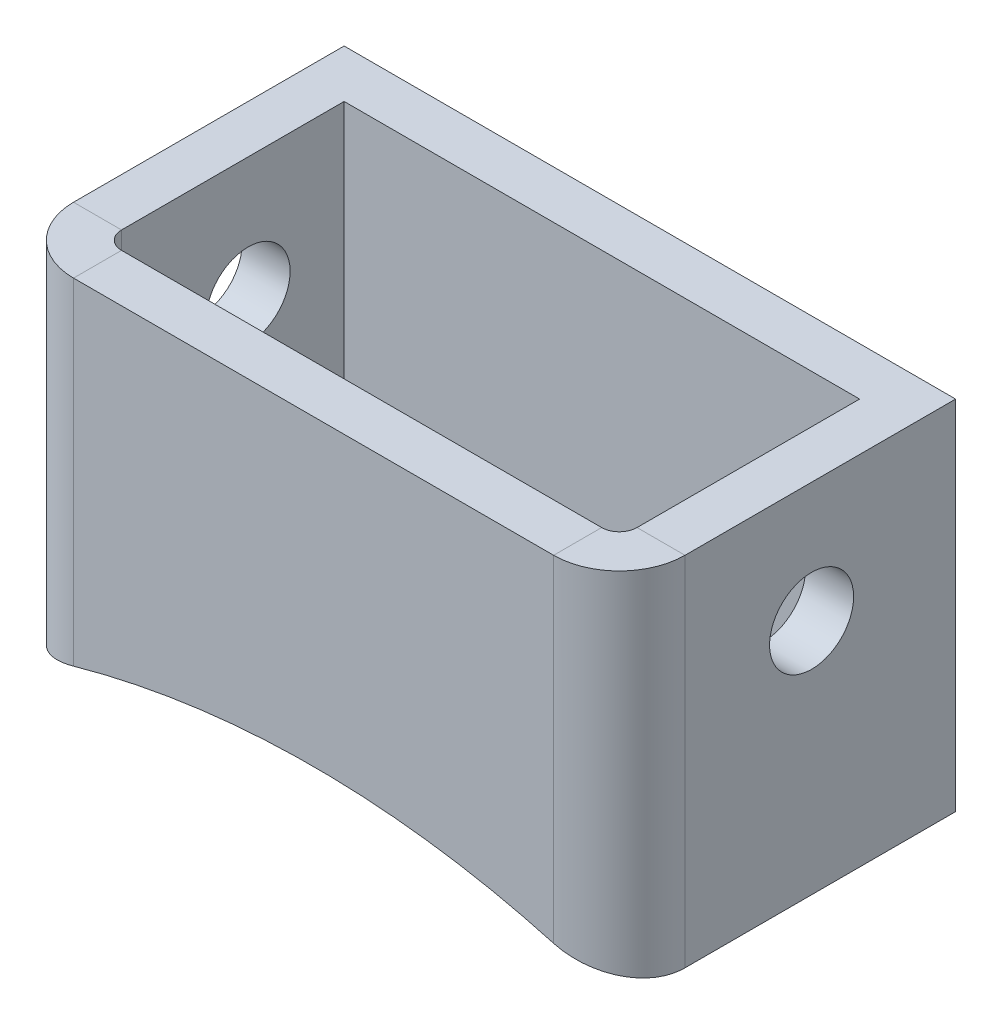
ISO-10303-21;
HEADER;
FILE_DESCRIPTION(('STEP AP214'),'2;1');
FILE_NAME('part.step','',(''),(''),'','','');
FILE_SCHEMA(('AUTOMOTIVE_DESIGN { 1 0 10303 214 1 1 1 1 }'));
ENDSEC;
DATA;
#1=APPLICATION_CONTEXT('core data for automotive mechanical design processes');
#2=APPLICATION_PROTOCOL_DEFINITION('international standard','automotive_design',2000,#1);
#3=PRODUCT_CONTEXT('',#1,'mechanical');
#4=PRODUCT('Part','Part','',(#3));
#5=PRODUCT_RELATED_PRODUCT_CATEGORY('part','',(#4));
#6=PRODUCT_DEFINITION_FORMATION('','',#4);
#7=PRODUCT_DEFINITION_CONTEXT('part definition',#1,'design');
#8=PRODUCT_DEFINITION('design','',#6,#7);
#9=PRODUCT_DEFINITION_SHAPE('','',#8);
#10=(LENGTH_UNIT() NAMED_UNIT(*) SI_UNIT(.MILLI.,.METRE.));
#11=(NAMED_UNIT(*) PLANE_ANGLE_UNIT() SI_UNIT($,.RADIAN.));
#12=(NAMED_UNIT(*) SI_UNIT($,.STERADIAN.) SOLID_ANGLE_UNIT());
#13=UNCERTAINTY_MEASURE_WITH_UNIT(LENGTH_MEASURE(1.E-05),#10,'distance_accuracy_value','');
#14=(GEOMETRIC_REPRESENTATION_CONTEXT(3) GLOBAL_UNCERTAINTY_ASSIGNED_CONTEXT((#13)) GLOBAL_UNIT_ASSIGNED_CONTEXT((#10,
#11,#12)) REPRESENTATION_CONTEXT('',''));
#15=CARTESIAN_POINT('',(0.,0.,0.));
#16=DIRECTION('',(0.,0.,1.));
#17=DIRECTION('',(1.,0.,0.));
#18=AXIS2_PLACEMENT_3D('',#15,#16,#17);
#19=CARTESIAN_POINT('',(0.,-42.6230262611138,0.));
#20=DIRECTION('',(0.,0.,1.));
#21=DIRECTION('',(1.,0.,0.));
#22=AXIS2_PLACEMENT_3D('',#19,#20,#21);
#23=PLANE('',#22);
#24=CARTESIAN_POINT('',(0.,-42.6230262611138,0.));
#25=DIRECTION('',(0.,0.,-1.));
#26=DIRECTION('',(1.,0.,0.));
#27=AXIS2_PLACEMENT_3D('',#24,#25,#26);
#28=CIRCLE('',#27,37.);
#29=CARTESIAN_POINT('',(-9.99999999999999,-7.,0.));
#30=VERTEX_POINT('',#29);
#31=CARTESIAN_POINT('',(10.,-7.,0.));
#32=VERTEX_POINT('',#31);
#33=EDGE_CURVE('E235',#30,#32,#28,.T.);
#34=ORIENTED_EDGE('',*,*,#33,.T.);
#35=DIRECTION('',(0.,1.,0.));
#36=VECTOR('',#35,1.);
#37=CARTESIAN_POINT('',(9.99999999999999,-42.6230262611138,0.));
#38=LINE('',#37,#36);
#39=CARTESIAN_POINT('',(10.,7.,0.));
#40=VERTEX_POINT('',#39);
#41=EDGE_CURVE('E53',#32,#40,#38,.T.);
#42=ORIENTED_EDGE('',*,*,#41,.T.);
#43=DIRECTION('',(-1.,0.,0.));
#44=VECTOR('',#43,1.);
#45=CARTESIAN_POINT('',(-10.,7.,0.));
#46=LINE('',#45,#44);
#47=CARTESIAN_POINT('',(-10.,7.,0.));
#48=VERTEX_POINT('',#47);
#49=EDGE_CURVE('E68',#40,#48,#46,.T.);
#50=ORIENTED_EDGE('',*,*,#49,.T.);
#51=DIRECTION('',(0.,1.,0.));
#52=VECTOR('',#51,1.);
#53=CARTESIAN_POINT('',(-9.99999999999998,-42.6230262611138,0.));
#54=LINE('',#53,#52);
#55=EDGE_CURVE('E238',#30,#48,#54,.T.);
#56=ORIENTED_EDGE('',*,*,#55,.F.);
#57=EDGE_LOOP('',(#34,#42,#50,#56));
#58=FACE_BOUND('',#57,.T.);
#59=ADVANCED_FACE('F46',(#58),#23,.T.);
#60=CARTESIAN_POINT('',(-10.,7.,-2.));
#61=DIRECTION('',(0.,1.,0.));
#62=DIRECTION('',(-1.,0.,0.));
#63=AXIS2_PLACEMENT_3D('',#60,#61,#62);
#64=PLANE('',#63);
#65=ORIENTED_EDGE('',*,*,#49,.F.);
#66=DIRECTION('',(0.,0.,-1.));
#67=VECTOR('',#66,1.);
#68=CARTESIAN_POINT('',(10.,6.99999999999999,-2.));
#69=LINE('',#68,#67);
#70=CARTESIAN_POINT('',(10.,7.,-2.));
#71=VERTEX_POINT('',#70);
#72=EDGE_CURVE('E262',#40,#71,#69,.T.);
#73=ORIENTED_EDGE('',*,*,#72,.T.);
#74=DIRECTION('',(-1.,0.,0.));
#75=VECTOR('',#74,1.);
#76=CARTESIAN_POINT('',(10.,7.,-2.));
#77=LINE('',#76,#75);
#78=CARTESIAN_POINT('',(-10.,7.00000000000001,-2.));
#79=VERTEX_POINT('',#78);
#80=EDGE_CURVE('E255',#71,#79,#77,.T.);
#81=ORIENTED_EDGE('',*,*,#80,.T.);
#82=DIRECTION('',(0.,0.,-1.));
#83=VECTOR('',#82,1.);
#84=CARTESIAN_POINT('',(-10.,7.,-2.));
#85=LINE('',#84,#83);
#86=EDGE_CURVE('E270',#48,#79,#85,.T.);
#87=ORIENTED_EDGE('',*,*,#86,.F.);
#88=EDGE_LOOP('',(#65,#73,#81,#87));
#89=FACE_BOUND('',#88,.T.);
#90=ADVANCED_FACE('F228',(#89),#64,.T.);
#91=CARTESIAN_POINT('',(0.,-42.6230262611138,-2.));
#92=DIRECTION('',(0.,0.,1.));
#93=DIRECTION('',(1.,0.,0.));
#94=AXIS2_PLACEMENT_3D('',#91,#92,#93);
#95=PLANE('',#94);
#96=DIRECTION('',(0.,1.,0.));
#97=VECTOR('',#96,1.);
#98=CARTESIAN_POINT('',(9.99999999999999,-42.6230262611138,-2.));
#99=LINE('',#98,#97);
#100=CARTESIAN_POINT('',(9.99999999999997,-6.99999999999999,-2.));
#101=VERTEX_POINT('',#100);
#102=EDGE_CURVE('E264',#101,#71,#99,.T.);
#103=ORIENTED_EDGE('',*,*,#102,.F.);
#104=CARTESIAN_POINT('',(0.,-42.6230262611138,-2.));
#105=DIRECTION('',(0.,0.,-1.));
#106=DIRECTION('',(1.,0.,0.));
#107=AXIS2_PLACEMENT_3D('',#104,#105,#106);
#108=CIRCLE('',#107,37.);
#109=CARTESIAN_POINT('',(-10.,-7.,-2.));
#110=VERTEX_POINT('',#109);
#111=EDGE_CURVE('E241',#110,#101,#108,.T.);
#112=ORIENTED_EDGE('',*,*,#111,.F.);
#113=DIRECTION('',(0.,1.,0.));
#114=VECTOR('',#113,1.);
#115=CARTESIAN_POINT('',(-9.99999999999998,-42.6230262611138,-2.));
#116=LINE('',#115,#114);
#117=EDGE_CURVE('E252',#110,#79,#116,.T.);
#118=ORIENTED_EDGE('',*,*,#117,.T.);
#119=ORIENTED_EDGE('',*,*,#80,.F.);
#120=EDGE_LOOP('',(#103,#112,#118,#119));
#121=FACE_BOUND('',#120,.T.);
#122=ADVANCED_FACE('F232',(#121),#95,.F.);
#123=CARTESIAN_POINT('',(0.,-42.6230262611138,-2.));
#124=DIRECTION('',(0.,0.,1.));
#125=DIRECTION('',(1.,0.,0.));
#126=AXIS2_PLACEMENT_3D('',#123,#124,#125);
#127=CYLINDRICAL_SURFACE('',#126,37.);
#128=DIRECTION('',(0.,0.,1.));
#129=VECTOR('',#128,1.);
#130=CARTESIAN_POINT('',(-12.7366,-7.88430117742651,-12.008755098888));
#131=LINE('',#130,#129);
#132=CARTESIAN_POINT('',(-12.7366,-7.88430117742651,-2.73660000000001));
#133=VERTEX_POINT('',#132);
#134=CARTESIAN_POINT('',(-12.7366,-7.88430117742651,-14.008755098888));
#135=VERTEX_POINT('',#134);
#136=EDGE_CURVE('E133',#133,#135,#131,.F.);
#137=ORIENTED_EDGE('',*,*,#136,.T.);
#138=CARTESIAN_POINT('',(0.,-42.6230262611138,-14.0087550988879));
#139=DIRECTION('',(0.,0.,1.));
#140=DIRECTION('',(-1.,0.,0.));
#141=AXIS2_PLACEMENT_3D('',#138,#139,#140);
#142=CIRCLE('',#141,37.);
#143=CARTESIAN_POINT('',(12.7366,-7.88430117742651,-14.0087550988879));
#144=VERTEX_POINT('',#143);
#145=EDGE_CURVE('E138',#144,#135,#142,.T.);
#146=ORIENTED_EDGE('',*,*,#145,.F.);
#147=DIRECTION('',(0.,0.,1.));
#148=VECTOR('',#147,1.);
#149=CARTESIAN_POINT('',(12.7366,-7.88430117742651,-12.008755098888));
#150=LINE('',#149,#148);
#151=CARTESIAN_POINT('',(12.7366,-7.88430117742651,-2.73660000000001));
#152=VERTEX_POINT('',#151);
#153=EDGE_CURVE('E12',#144,#152,#150,.T.);
#154=ORIENTED_EDGE('',*,*,#153,.T.);
#155=CARTESIAN_POINT('',(10.,-7.,0.));
#156=CARTESIAN_POINT('',(10.0801845847465,-7.0225075778265,-2.12807200125814E-06));
#157=CARTESIAN_POINT('',(10.1602514430509,-7.04527778473895,-0.00352601899241796));
#158=CARTESIAN_POINT('',(10.3196581031105,-7.0911881476095,-0.0175546622057625));
#159=CARTESIAN_POINT('',(10.3989979583464,-7.11432827600562,-0.0280588967537208));
#160=CARTESIAN_POINT('',(10.6350541967788,-7.1840304035154,-0.069921720972413));
#161=CARTESIAN_POINT('',(10.7899653452446,-7.23091858949792,-0.111630691592509));
#162=CARTESIAN_POINT('',(11.0903438140423,-7.32388927577783,-0.221495793882068));
#163=CARTESIAN_POINT('',(11.2358076800037,-7.36997147691898,-0.289661536542211));
#164=CARTESIAN_POINT('',(11.5131776821841,-7.45957967628752,-0.450780522340026));
#165=CARTESIAN_POINT('',(11.6450867593086,-7.50310622811747,-0.543728372846455));
#166=CARTESIAN_POINT('',(11.8903188382513,-7.58537589788197,-0.7513348230409));
#167=CARTESIAN_POINT('',(12.0037853572622,-7.62415530852631,-0.865809171736112));
#168=CARTESIAN_POINT('',(12.2096461533767,-7.6954377402894,-1.11412399827216));
#169=CARTESIAN_POINT('',(12.3020405774191,-7.72794080517375,-1.24796434106053));
#170=CARTESIAN_POINT('',(12.4586523913245,-7.78355718915816,-1.52490771359534));
#171=CARTESIAN_POINT('',(12.5239386150431,-7.80702331044505,-1.6673357212594));
#172=CARTESIAN_POINT('',(12.6293987513465,-7.84513853741427,-1.96221776949164));
#173=CARTESIAN_POINT('',(12.6696097549764,-7.85980066468962,-2.11465663111801));
#174=CARTESIAN_POINT('',(12.7098021196491,-7.87448517012132,-2.34660222997776));
#175=CARTESIAN_POINT('',(12.7198453466661,-7.87816174359698,-2.42426573062631));
#176=CARTESIAN_POINT('',(12.7332408231143,-7.88306938214672,-2.58013848376027));
#177=CARTESIAN_POINT('',(12.7366020649886,-7.8843037338891,-2.65834686044038));
#178=CARTESIAN_POINT('',(12.7366,-7.88430117742652,-2.73660000000001));
#179=B_SPLINE_CURVE_WITH_KNOTS('',3,(#155,#156,#157,#158,#159,#160,#161,#162,#163,#164,#165,
#166,#167,#168,#169,#170,#171,#172,#173,#174,#175,#176,#177,#178),.UNSPECIFIED.,.F.,.F.,(4,2,2,
2,2,2,2,2,2,2,2,4),(0.,0.249693151051311,0.499367783967622,0.99823063732481,1.49727488320284,
1.99621062465699,2.49105567204079,2.98589726869419,3.45876997442031,3.93094154141254,
4.16584769723871,4.40043750783985),.UNSPECIFIED.);
#180=EDGE_CURVE('E166',#32,#152,#179,.T.);
#181=ORIENTED_EDGE('',*,*,#180,.F.);
#182=ORIENTED_EDGE('',*,*,#33,.F.);
#183=CARTESIAN_POINT('',(-12.7366,-7.88430117742653,-2.73660000000001));
#184=CARTESIAN_POINT('',(-12.7366097555338,-7.88430656898134,-2.66280631785439));
#185=CARTESIAN_POINT('',(-12.7336153607624,-7.88320693523408,-2.58901800432565));
#186=CARTESIAN_POINT('',(-12.7216934532458,-7.87883841128455,-2.44200104918887));
#187=CARTESIAN_POINT('',(-12.7127671109886,-7.87556994903427,-2.36877230005075));
#188=CARTESIAN_POINT('',(-12.6890872952837,-7.86691581027345,-2.22358308035936));
#189=CARTESIAN_POINT('',(-12.674349050078,-7.8615356669223,-2.15161980468585));
#190=CARTESIAN_POINT('',(-12.6392023019516,-7.84874104204694,-2.00929582459949));
#191=CARTESIAN_POINT('',(-12.6187936989264,-7.84132652460791,-1.93893514850266));
#192=CARTESIAN_POINT('',(-12.5493317126597,-7.816177367903,-1.73102466997235));
#193=CARTESIAN_POINT('',(-12.4920144830641,-7.79552687427465,-1.59647899549374));
#194=CARTESIAN_POINT('',(-12.3573914973734,-7.74753415982773,-1.33916708142544));
#195=CARTESIAN_POINT('',(-12.2800781107103,-7.72018938467321,-1.21640536318817));
#196=CARTESIAN_POINT('',(-12.1053634408839,-7.65920266175515,-0.982067588911619));
#197=CARTESIAN_POINT('',(-12.0074453505414,-7.6254013107182,-0.870918313973927));
#198=CARTESIAN_POINT('',(-11.7958466781704,-7.55351705715905,-0.666435144820876));
#199=CARTESIAN_POINT('',(-11.6821610820927,-7.515432793407,-0.573106940213462));
#200=CARTESIAN_POINT('',(-11.4353193870663,-7.43423188979784,-0.40150440198421));
#201=CARTESIAN_POINT('',(-11.3014309781955,-7.3909530434422,-0.324360033867502));
#202=CARTESIAN_POINT('',(-11.0230395775459,-7.30286340899783,-0.193766316113899));
#203=CARTESIAN_POINT('',(-10.8785379305266,-7.25805281537378,-0.140313970575525));
#204=CARTESIAN_POINT('',(-10.611883348063,-7.17724670357954,-0.066437875190186));
#205=CARTESIAN_POINT('',(-10.4909366903301,-7.14125392791213,-0.0415815748227314));
#206=CARTESIAN_POINT('',(-10.2467382498197,-7.0699561749253,-0.00835797875806363));
#207=CARTESIAN_POINT('',(-10.1234889184221,-7.0346505396878,2.59443549787236E-05));
#208=CARTESIAN_POINT('',(-9.99999999999999,-7.,0.));
#209=B_SPLINE_CURVE_WITH_KNOTS('',3,(#183,#184,#185,#186,#187,#188,#189,#190,#191,#192,#193,
#194,#195,#196,#197,#198,#199,#200,#201,#202,#203,#204,#205,#206,#207,#208),.UNSPECIFIED.,.F.,
.F.,(4,2,2,2,2,2,2,2,2,2,2,2,4),(0.,0.221302932133514,0.442562209880058,0.663245559590713,
0.883932805493449,1.32480372616884,1.76584313281006,2.21965230045372,2.67360611120394,
3.15287929820443,3.63209186289335,4.01688556668463,4.4012906551213),.UNSPECIFIED.);
#210=EDGE_CURVE('E60',#133,#30,#209,.T.);
#211=ORIENTED_EDGE('',*,*,#210,.F.);
#212=EDGE_LOOP('',(#137,#146,#154,#181,#182,#211));
#213=FACE_BOUND('',#212,.T.);
#214=CARTESIAN_POINT('',(0.,-42.6230262611138,-12.0087550988879));
#215=DIRECTION('',(0.,0.,1.));
#216=DIRECTION('',(-1.,0.,0.));
#217=AXIS2_PLACEMENT_3D('',#214,#215,#216);
#218=CIRCLE('',#217,37.);
#219=CARTESIAN_POINT('',(10.7366,-7.2150409973346,-12.0087550988879));
#220=VERTEX_POINT('',#219);
#221=CARTESIAN_POINT('',(-10.7366,-7.21504099733462,-12.008755098888));
#222=VERTEX_POINT('',#221);
#223=EDGE_CURVE('E161',#220,#222,#218,.T.);
#224=ORIENTED_EDGE('',*,*,#223,.T.);
#225=DIRECTION('',(0.,0.,1.));
#226=VECTOR('',#225,1.);
#227=CARTESIAN_POINT('',(-10.7366,-7.21504099733461,-12.008755098888));
#228=LINE('',#227,#226);
#229=CARTESIAN_POINT('',(-10.7366,-7.21504099733462,-2.73660000000001));
#230=VERTEX_POINT('',#229);
#231=EDGE_CURVE('E355',#230,#222,#228,.F.);
#232=ORIENTED_EDGE('',*,*,#231,.F.);
#233=CARTESIAN_POINT('',(-10.7366,-7.21504099733462,-2.73660000000001));
#234=CARTESIAN_POINT('',(-10.7366405291223,-7.21505523953232,-2.69641894385064));
#235=CARTESIAN_POINT('',(-10.7333149327217,-7.2140449006433,-2.65625955687454));
#236=CARTESIAN_POINT('',(-10.7202436369626,-7.21008428693913,-2.57717848269061));
#237=CARTESIAN_POINT('',(-10.7105109761175,-7.20713795194003,-2.53825444978144));
#238=CARTESIAN_POINT('',(-10.6849350011425,-7.19941364436764,-2.4626651622564));
#239=CARTESIAN_POINT('',(-10.669091488863,-7.19463561240002,-2.42599998093047));
#240=CARTESIAN_POINT('',(-10.6318357630462,-7.18343755208298,-2.35589218235575));
#241=CARTESIAN_POINT('',(-10.6104225372193,-7.17701722525174,-2.32245015242712));
#242=CARTESIAN_POINT('',(-10.5622371645063,-7.16262880730122,-2.25901667881266));
#243=CARTESIAN_POINT('',(-10.5353705428159,-7.15463351582628,-2.22910326965812));
#244=CARTESIAN_POINT('',(-10.4773468076747,-7.13745005787531,-2.1741800007083));
#245=CARTESIAN_POINT('',(-10.4461885642729,-7.12826157727834,-2.14917143653832));
#246=CARTESIAN_POINT('',(-10.3791159999316,-7.10858948790889,-2.10370352331803));
#247=CARTESIAN_POINT('',(-10.3430602957931,-7.0980685300923,-2.08346905341121));
#248=CARTESIAN_POINT('',(-10.2682452220965,-7.07637162227517,-2.04934898465961));
#249=CARTESIAN_POINT('',(-10.2294860714049,-7.06519572530908,-2.03546287254849));
#250=CARTESIAN_POINT('',(-10.1589194352741,-7.04497975931061,-2.01663253442763));
#251=CARTESIAN_POINT('',(-10.1274300607598,-7.03600288796357,-2.01040136195505));
#252=CARTESIAN_POINT('',(-10.0639675695632,-7.01800329697117,-2.00208470881273));
#253=CARTESIAN_POINT('',(-10.031995153245,-7.00898065434119,-1.99999371604429));
#254=CARTESIAN_POINT('',(-9.99999999999999,-7.,-2.));
#255=B_SPLINE_CURVE_WITH_KNOTS('',3,(#233,#234,#235,#236,#237,#238,#239,#240,#241,#242,#243,
#244,#245,#246,#247,#248,#249,#250,#251,#252,#253,#254),.UNSPECIFIED.,.F.,.F.,(4,2,2,2,2,2,2,2,
2,2,4),(0.,0.120359981769753,0.240475782442453,0.360595478301666,0.480737021060301,
0.60317144637214,0.725638169569425,0.853057634113529,0.980466794938911,1.08020891086095,
1.17981814388896),.UNSPECIFIED.);
#256=EDGE_CURVE('E171',#230,#110,#255,.T.);
#257=ORIENTED_EDGE('',*,*,#256,.T.);
#258=ORIENTED_EDGE('',*,*,#111,.T.);
#259=CARTESIAN_POINT('',(10.,-7.,-2.));
#260=CARTESIAN_POINT('',(10.0427907883544,-7.01200890782724,-1.99997161494376));
#261=CARTESIAN_POINT('',(10.0855540682357,-7.02409959326559,-2.00372716069423));
#262=CARTESIAN_POINT('',(10.1698536200498,-7.04809214177435,-2.01858168322031));
#263=CARTESIAN_POINT('',(10.211389556147,-7.05999395275848,-2.02968265082269));
#264=CARTESIAN_POINT('',(10.2920678165971,-7.08325809163179,-2.05901421842843));
#265=CARTESIAN_POINT('',(10.3312083447529,-7.09462001329155,-2.07725009459495));
#266=CARTESIAN_POINT('',(10.405882980175,-7.11641970967381,-2.12040507273586));
#267=CARTESIAN_POINT('',(10.4414186519637,-7.12685788505282,-2.14532125817577));
#268=CARTESIAN_POINT('',(10.5072299563814,-7.14628345493643,-2.20076537396584));
#269=CARTESIAN_POINT('',(10.5375816535361,-7.15529166086092,-2.23119557700124));
#270=CARTESIAN_POINT('',(10.5927055584612,-7.17171573004138,-2.29713985163738));
#271=CARTESIAN_POINT('',(10.6174773890199,-7.17913148564253,-2.3326542666771));
#272=CARTESIAN_POINT('',(10.6596956820644,-7.19180617464733,-2.40627747692548));
#273=CARTESIAN_POINT('',(10.677388428178,-7.19713743907602,-2.44423278631746));
#274=CARTESIAN_POINT('',(10.7061175068424,-7.2058090391037,-2.52277596648376));
#275=CARTESIAN_POINT('',(10.7171620114846,-7.20915181891003,-2.5633605370567));
#276=CARTESIAN_POINT('',(10.7286423259734,-7.21262878438845,-2.62636714591633));
#277=CARTESIAN_POINT('',(10.7316249632515,-7.21353272672865,-2.64831326950732));
#278=CARTESIAN_POINT('',(10.7356028042427,-7.21473861017044,-2.69236910961315));
#279=CARTESIAN_POINT('',(10.7366008838755,-7.21504142239809,-2.71447854272921));
#280=CARTESIAN_POINT('',(10.7366000000002,-7.21504099733455,-2.73659999999996));
#281=B_SPLINE_CURVE_WITH_KNOTS('',3,(#259,#260,#261,#262,#263,#264,#265,#266,#267,#268,#269,
#270,#271,#272,#273,#274,#275,#276,#277,#278,#279,#280),.UNSPECIFIED.,.F.,.F.,(4,2,2,2,2,2,2,2,
2,2,4),(0.,0.133169086149919,0.26637427985589,0.399678163645382,0.532923943229332,
0.664005370545511,0.795095656605858,0.921115356423038,1.04697983342567,1.11339235111377,
1.1797085568224),.UNSPECIFIED.);
#282=CARTESIAN_POINT('',(10.7366,-7.21504099733461,-2.7366));
#283=VERTEX_POINT('',#282);
#284=EDGE_CURVE('E141',#101,#283,#281,.T.);
#285=ORIENTED_EDGE('',*,*,#284,.T.);
#286=DIRECTION('',(0.,0.,1.));
#287=VECTOR('',#286,1.);
#288=CARTESIAN_POINT('',(10.7366,-7.21504099733461,-12.008755098888));
#289=LINE('',#288,#287);
#290=EDGE_CURVE('E358',#220,#283,#289,.T.);
#291=ORIENTED_EDGE('',*,*,#290,.F.);
#292=EDGE_LOOP('',(#224,#232,#257,#258,#285,#291));
#293=FACE_BOUND('',#292,.T.);
#294=ADVANCED_FACE('F135',(#213,#293),#127,.F.);
#295=CARTESIAN_POINT('',(-10.,7.,-2.7366));
#296=DIRECTION('',(0.,-1.,0.));
#297=DIRECTION('',(0.,0.,-1.));
#298=AXIS2_PLACEMENT_3D('',#295,#296,#297);
#299=PLANE('',#298);
#300=DIRECTION('',(1.,0.,0.));
#301=VECTOR('',#300,1.);
#302=CARTESIAN_POINT('',(-10.7366,7.,-2.73660000000001));
#303=LINE('',#302,#301);
#304=CARTESIAN_POINT('',(-12.7366,7.,-2.73660000000001));
#305=VERTEX_POINT('',#304);
#306=CARTESIAN_POINT('',(-10.7366,7.,-2.7366));
#307=VERTEX_POINT('',#306);
#308=EDGE_CURVE('E297',#305,#307,#303,.T.);
#309=ORIENTED_EDGE('',*,*,#308,.F.);
#310=CARTESIAN_POINT('',(-10.,7.,-2.7366));
#311=DIRECTION('',(0.,1.,0.));
#312=DIRECTION('',(-1.,0.,0.));
#313=AXIS2_PLACEMENT_3D('',#310,#311,#312);
#314=CIRCLE('',#313,2.7366);
#315=EDGE_CURVE('E244',#305,#48,#314,.T.);
#316=ORIENTED_EDGE('',*,*,#315,.T.);
#317=ORIENTED_EDGE('',*,*,#86,.T.);
#318=CARTESIAN_POINT('',(-10.,7.,-2.7366));
#319=DIRECTION('',(0.,1.,0.));
#320=DIRECTION('',(0.,0.,-1.));
#321=AXIS2_PLACEMENT_3D('',#318,#319,#320);
#322=CIRCLE('',#321,0.7366);
#323=EDGE_CURVE('E239',#307,#79,#322,.T.);
#324=ORIENTED_EDGE('',*,*,#323,.F.);
#325=EDGE_LOOP('',(#309,#316,#317,#324));
#326=FACE_BOUND('',#325,.T.);
#327=ADVANCED_FACE('F339',(#326),#299,.F.);
#328=CARTESIAN_POINT('',(-9.99999999999999,-16.1718058620227,-2.7366));
#329=DIRECTION('',(0.,1.,0.));
#330=DIRECTION('',(-1.,0.,0.));
#331=AXIS2_PLACEMENT_3D('',#328,#329,#330);
#332=CYLINDRICAL_SURFACE('',#331,0.7366);
#333=ORIENTED_EDGE('',*,*,#256,.F.);
#334=DIRECTION('',(0.,1.,0.));
#335=VECTOR('',#334,1.);
#336=CARTESIAN_POINT('',(-10.7366,-42.6230262611138,-2.73660000000001));
#337=LINE('',#336,#335);
#338=EDGE_CURVE('E283',#230,#307,#337,.T.);
#339=ORIENTED_EDGE('',*,*,#338,.T.);
#340=ORIENTED_EDGE('',*,*,#323,.T.);
#341=ORIENTED_EDGE('',*,*,#117,.F.);
#342=EDGE_LOOP('',(#333,#339,#340,#341));
#343=FACE_BOUND('',#342,.T.);
#344=ADVANCED_FACE('F335',(#343),#332,.F.);
#345=CARTESIAN_POINT('',(-9.99999999999999,-16.1718058620227,-2.7366));
#346=DIRECTION('',(0.,1.,0.));
#347=DIRECTION('',(-1.,0.,0.));
#348=AXIS2_PLACEMENT_3D('',#345,#346,#347);
#349=CYLINDRICAL_SURFACE('',#348,2.7366);
#350=DIRECTION('',(0.,1.,0.));
#351=VECTOR('',#350,1.);
#352=CARTESIAN_POINT('',(-12.7366,-42.6230262611138,-2.73660000000001));
#353=LINE('',#352,#351);
#354=EDGE_CURVE('E294',#133,#305,#353,.T.);
#355=ORIENTED_EDGE('',*,*,#354,.F.);
#356=ORIENTED_EDGE('',*,*,#210,.T.);
#357=ORIENTED_EDGE('',*,*,#55,.T.);
#358=ORIENTED_EDGE('',*,*,#315,.F.);
#359=EDGE_LOOP('',(#355,#356,#357,#358));
#360=FACE_BOUND('',#359,.T.);
#361=ADVANCED_FACE('F330',(#360),#349,.T.);
#362=CARTESIAN_POINT('',(-10.7366,2.,-8.00875509888798));
#363=DIRECTION('',(-1.,0.,0.));
#364=DIRECTION('',(0.,0.,1.));
#365=AXIS2_PLACEMENT_3D('',#362,#363,#364);
#366=CYLINDRICAL_SURFACE('',#365,1.75000000000001);
#367=CARTESIAN_POINT('',(-10.7366,2.,-8.00875509888798));
#368=DIRECTION('',(-1.,0.,0.));
#369=DIRECTION('',(0.,0.,-1.));
#370=AXIS2_PLACEMENT_3D('',#367,#368,#369);
#371=CIRCLE('',#370,1.75000000000001);
#372=CARTESIAN_POINT('',(-10.7366,2.00000000000001,-9.75875509888799));
#373=VERTEX_POINT('',#372);
#374=EDGE_CURVE('E291',#373,#373,#371,.T.);
#375=ORIENTED_EDGE('',*,*,#374,.F.);
#376=EDGE_LOOP('',(#375));
#377=FACE_BOUND('',#376,.T.);
#378=CARTESIAN_POINT('',(-12.7366,2.,-8.00875509888799));
#379=DIRECTION('',(-1.,0.,0.));
#380=DIRECTION('',(0.,0.,-1.));
#381=AXIS2_PLACEMENT_3D('',#378,#379,#380);
#382=CIRCLE('',#381,1.75000000000001);
#383=CARTESIAN_POINT('',(-12.7366,2.,-9.758755098888));
#384=VERTEX_POINT('',#383);
#385=EDGE_CURVE('E285',#384,#384,#382,.T.);
#386=ORIENTED_EDGE('',*,*,#385,.T.);
#387=EDGE_LOOP('',(#386));
#388=FACE_BOUND('',#387,.T.);
#389=ADVANCED_FACE('F334',(#377,#388),#366,.F.);
#390=CARTESIAN_POINT('',(-10.7366,-42.6230262611138,9.991244901112));
#391=DIRECTION('',(-1.,0.,0.));
#392=DIRECTION('',(0.,0.,1.));
#393=AXIS2_PLACEMENT_3D('',#390,#391,#392);
#394=PLANE('',#393);
#395=ORIENTED_EDGE('',*,*,#338,.F.);
#396=ORIENTED_EDGE('',*,*,#231,.T.);
#397=DIRECTION('',(0.,-1.,0.));
#398=VECTOR('',#397,1.);
#399=CARTESIAN_POINT('',(-10.7366,7.00000000000001,-12.008755098888));
#400=LINE('',#399,#398);
#401=CARTESIAN_POINT('',(-10.7366,7.00000000000001,-12.008755098888));
#402=VERTEX_POINT('',#401);
#403=EDGE_CURVE('E289',#402,#222,#400,.T.);
#404=ORIENTED_EDGE('',*,*,#403,.F.);
#405=DIRECTION('',(0.,0.,-1.));
#406=VECTOR('',#405,1.);
#407=CARTESIAN_POINT('',(-10.7366000000001,7.,19.991244901112));
#408=LINE('',#407,#406);
#409=EDGE_CURVE('E281',#307,#402,#408,.T.);
#410=ORIENTED_EDGE('',*,*,#409,.F.);
#411=EDGE_LOOP('',(#395,#396,#404,#410));
#412=FACE_BOUND('',#411,.T.);
#413=ORIENTED_EDGE('',*,*,#374,.T.);
#414=EDGE_LOOP('',(#413));
#415=FACE_BOUND('',#414,.T.);
#416=ADVANCED_FACE('F371',(#412,#415),#394,.F.);
#417=CARTESIAN_POINT('',(-12.7366,-42.6230262611138,9.99124490111199));
#418=DIRECTION('',(-1.,0.,0.));
#419=DIRECTION('',(0.,0.,1.));
#420=AXIS2_PLACEMENT_3D('',#417,#418,#419);
#421=PLANE('',#420);
#422=ORIENTED_EDGE('',*,*,#136,.F.);
#423=ORIENTED_EDGE('',*,*,#354,.T.);
#424=DIRECTION('',(0.,0.,-1.));
#425=VECTOR('',#424,1.);
#426=CARTESIAN_POINT('',(-12.7366,7.,-0.00875509888798726));
#427=LINE('',#426,#425);
#428=CARTESIAN_POINT('',(-12.7366,7.00000000000001,-14.008755098888));
#429=VERTEX_POINT('',#428);
#430=EDGE_CURVE('E148',#305,#429,#427,.T.);
#431=ORIENTED_EDGE('',*,*,#430,.T.);
#432=DIRECTION('',(0.,1.,0.));
#433=VECTOR('',#432,1.);
#434=CARTESIAN_POINT('',(-12.7366,7.00000000000001,-14.008755098888));
#435=LINE('',#434,#433);
#436=EDGE_CURVE('E144',#135,#429,#435,.T.);
#437=ORIENTED_EDGE('',*,*,#436,.F.);
#438=EDGE_LOOP('',(#422,#423,#431,#437));
#439=FACE_BOUND('',#438,.T.);
#440=ORIENTED_EDGE('',*,*,#385,.F.);
#441=EDGE_LOOP('',(#440));
#442=FACE_BOUND('',#441,.T.);
#443=ADVANCED_FACE('F145',(#439,#442),#421,.T.);
#444=CARTESIAN_POINT('',(-10.7366,7.,-0.00875509888798032));
#445=DIRECTION('',(0.,1.,0.));
#446=DIRECTION('',(0.,0.,-1.));
#447=AXIS2_PLACEMENT_3D('',#444,#445,#446);
#448=PLANE('',#447);
#449=ORIENTED_EDGE('',*,*,#430,.F.);
#450=ORIENTED_EDGE('',*,*,#308,.T.);
#451=ORIENTED_EDGE('',*,*,#409,.T.);
#452=DIRECTION('',(1.,0.,0.));
#453=VECTOR('',#452,1.);
#454=CARTESIAN_POINT('',(12.7366,7.,-12.0087550988879));
#455=LINE('',#454,#453);
#456=CARTESIAN_POINT('',(10.7366,7.,-12.0087550988879));
#457=VERTEX_POINT('',#456);
#458=EDGE_CURVE('E158',#402,#457,#455,.T.);
#459=ORIENTED_EDGE('',*,*,#458,.T.);
#460=DIRECTION('',(0.,0.,1.));
#461=VECTOR('',#460,1.);
#462=CARTESIAN_POINT('',(10.7366,7.,-0.00875509888797858));
#463=LINE('',#462,#461);
#464=CARTESIAN_POINT('',(10.7366,7.,-2.7366));
#465=VERTEX_POINT('',#464);
#466=EDGE_CURVE('E321',#457,#465,#463,.T.);
#467=ORIENTED_EDGE('',*,*,#466,.T.);
#468=DIRECTION('',(-1.,0.,0.));
#469=VECTOR('',#468,1.);
#470=CARTESIAN_POINT('',(10.7366,6.99999999999999,-2.7366));
#471=LINE('',#470,#469);
#472=CARTESIAN_POINT('',(12.7366,6.99999999999999,-2.73660000000001));
#473=VERTEX_POINT('',#472);
#474=EDGE_CURVE('E309',#473,#465,#471,.T.);
#475=ORIENTED_EDGE('',*,*,#474,.F.);
#476=DIRECTION('',(0.,0.,1.));
#477=VECTOR('',#476,1.);
#478=CARTESIAN_POINT('',(12.7366000000001,6.99999999999999,19.991244901112));
#479=LINE('',#478,#477);
#480=CARTESIAN_POINT('',(12.7366,7.,-14.0087550988879));
#481=VERTEX_POINT('',#480);
#482=EDGE_CURVE('E305',#481,#473,#479,.T.);
#483=ORIENTED_EDGE('',*,*,#482,.F.);
#484=DIRECTION('',(1.,0.,0.));
#485=VECTOR('',#484,1.);
#486=CARTESIAN_POINT('',(12.7366,7.,-14.0087550988879));
#487=LINE('',#486,#485);
#488=EDGE_CURVE('E152',#429,#481,#487,.T.);
#489=ORIENTED_EDGE('',*,*,#488,.F.);
#490=EDGE_LOOP('',(#449,#450,#451,#459,#467,#475,#483,#489));
#491=FACE_BOUND('',#490,.T.);
#492=ADVANCED_FACE('F368',(#491),#448,.T.);
#493=CARTESIAN_POINT('',(10.,7.,-2.7366));
#494=DIRECTION('',(0.,-1.,0.));
#495=DIRECTION('',(0.,0.,-1.));
#496=AXIS2_PLACEMENT_3D('',#493,#494,#495);
#497=PLANE('',#496);
#498=CARTESIAN_POINT('',(10.,7.,-2.7366));
#499=DIRECTION('',(0.,-1.,0.));
#500=DIRECTION('',(1.,0.,0.));
#501=AXIS2_PLACEMENT_3D('',#498,#499,#500);
#502=CIRCLE('',#501,2.7366);
#503=EDGE_CURVE('E302',#40,#473,#502,.F.);
#504=ORIENTED_EDGE('',*,*,#503,.T.);
#505=ORIENTED_EDGE('',*,*,#474,.T.);
#506=CARTESIAN_POINT('',(10.,7.,-2.7366));
#507=DIRECTION('',(0.,1.,0.));
#508=DIRECTION('',(0.,0.,-1.));
#509=AXIS2_PLACEMENT_3D('',#506,#507,#508);
#510=CIRCLE('',#509,0.7366);
#511=EDGE_CURVE('E286',#71,#465,#510,.T.);
#512=ORIENTED_EDGE('',*,*,#511,.F.);
#513=ORIENTED_EDGE('',*,*,#72,.F.);
#514=EDGE_LOOP('',(#504,#505,#512,#513));
#515=FACE_BOUND('',#514,.T.);
#516=ADVANCED_FACE('F213',(#515),#497,.F.);
#517=CARTESIAN_POINT('',(10.,14.9718058620227,-2.7366));
#518=DIRECTION('',(0.,-1.,0.));
#519=DIRECTION('',(1.,0.,0.));
#520=AXIS2_PLACEMENT_3D('',#517,#518,#519);
#521=CYLINDRICAL_SURFACE('',#520,0.7366);
#522=ORIENTED_EDGE('',*,*,#284,.F.);
#523=ORIENTED_EDGE('',*,*,#102,.T.);
#524=ORIENTED_EDGE('',*,*,#511,.T.);
#525=DIRECTION('',(0.,1.,0.));
#526=VECTOR('',#525,1.);
#527=CARTESIAN_POINT('',(10.7366,-42.6230262611138,-2.7366));
#528=LINE('',#527,#526);
#529=EDGE_CURVE('E319',#283,#465,#528,.T.);
#530=ORIENTED_EDGE('',*,*,#529,.F.);
#531=EDGE_LOOP('',(#522,#523,#524,#530));
#532=FACE_BOUND('',#531,.T.);
#533=ADVANCED_FACE('F209',(#532),#521,.F.);
#534=CARTESIAN_POINT('',(10.,14.9718058620227,-2.7366));
#535=DIRECTION('',(0.,-1.,0.));
#536=DIRECTION('',(1.,0.,0.));
#537=AXIS2_PLACEMENT_3D('',#534,#535,#536);
#538=CYLINDRICAL_SURFACE('',#537,2.7366);
#539=ORIENTED_EDGE('',*,*,#41,.F.);
#540=ORIENTED_EDGE('',*,*,#180,.T.);
#541=DIRECTION('',(0.,1.,0.));
#542=VECTOR('',#541,1.);
#543=CARTESIAN_POINT('',(12.7366,-42.6230262611138,-2.73660000000001));
#544=LINE('',#543,#542);
#545=EDGE_CURVE('E307',#152,#473,#544,.T.);
#546=ORIENTED_EDGE('',*,*,#545,.T.);
#547=ORIENTED_EDGE('',*,*,#503,.F.);
#548=EDGE_LOOP('',(#539,#540,#546,#547));
#549=FACE_BOUND('',#548,.T.);
#550=ADVANCED_FACE('F180',(#549),#538,.T.);
#551=CARTESIAN_POINT('',(10.7366,2.,-8.00875509888798));
#552=DIRECTION('',(1.,0.,0.));
#553=DIRECTION('',(0.,0.,-1.));
#554=AXIS2_PLACEMENT_3D('',#551,#552,#553);
#555=CYLINDRICAL_SURFACE('',#554,1.75);
#556=CARTESIAN_POINT('',(10.7366,2.,-8.00875509888798));
#557=DIRECTION('',(1.,0.,0.));
#558=DIRECTION('',(0.,0.,-1.));
#559=AXIS2_PLACEMENT_3D('',#556,#557,#558);
#560=CIRCLE('',#559,1.75);
#561=CARTESIAN_POINT('',(10.7366,2.,-9.75875509888798));
#562=VERTEX_POINT('',#561);
#563=EDGE_CURVE('E317',#562,#562,#560,.T.);
#564=ORIENTED_EDGE('',*,*,#563,.F.);
#565=EDGE_LOOP('',(#564));
#566=FACE_BOUND('',#565,.T.);
#567=CARTESIAN_POINT('',(12.7366,2.,-8.00875509888799));
#568=DIRECTION('',(1.,0.,0.));
#569=DIRECTION('',(0.,0.,-1.));
#570=AXIS2_PLACEMENT_3D('',#567,#568,#569);
#571=CIRCLE('',#570,1.75);
#572=CARTESIAN_POINT('',(12.7366,2.,-9.75875509888798));
#573=VERTEX_POINT('',#572);
#574=EDGE_CURVE('E314',#573,#573,#571,.T.);
#575=ORIENTED_EDGE('',*,*,#574,.T.);
#576=EDGE_LOOP('',(#575));
#577=FACE_BOUND('',#576,.T.);
#578=ADVANCED_FACE('F189',(#566,#577),#555,.F.);
#579=CARTESIAN_POINT('',(10.7366,-42.6230262611138,9.99124490111201));
#580=DIRECTION('',(1.,0.,0.));
#581=DIRECTION('',(0.,0.,-1.));
#582=AXIS2_PLACEMENT_3D('',#579,#580,#581);
#583=PLANE('',#582);
#584=ORIENTED_EDGE('',*,*,#563,.T.);
#585=EDGE_LOOP('',(#584));
#586=FACE_BOUND('',#585,.T.);
#587=DIRECTION('',(0.,1.,0.));
#588=VECTOR('',#587,1.);
#589=CARTESIAN_POINT('',(10.7366,7.,-12.008755098888));
#590=LINE('',#589,#588);
#591=EDGE_CURVE('E312',#220,#457,#590,.T.);
#592=ORIENTED_EDGE('',*,*,#591,.F.);
#593=ORIENTED_EDGE('',*,*,#290,.T.);
#594=ORIENTED_EDGE('',*,*,#529,.T.);
#595=ORIENTED_EDGE('',*,*,#466,.F.);
#596=EDGE_LOOP('',(#592,#593,#594,#595));
#597=FACE_BOUND('',#596,.T.);
#598=ADVANCED_FACE('F217',(#586,#597),#583,.F.);
#599=CARTESIAN_POINT('',(12.7366,-42.6230262611138,9.991244901112));
#600=DIRECTION('',(1.,0.,0.));
#601=DIRECTION('',(0.,0.,-1.));
#602=AXIS2_PLACEMENT_3D('',#599,#600,#601);
#603=PLANE('',#602);
#604=ORIENTED_EDGE('',*,*,#153,.F.);
#605=DIRECTION('',(0.,-1.,0.));
#606=VECTOR('',#605,1.);
#607=CARTESIAN_POINT('',(12.7366,-7.88430117742651,-14.0087550988879));
#608=LINE('',#607,#606);
#609=EDGE_CURVE('E157',#481,#144,#608,.T.);
#610=ORIENTED_EDGE('',*,*,#609,.F.);
#611=ORIENTED_EDGE('',*,*,#482,.T.);
#612=ORIENTED_EDGE('',*,*,#545,.F.);
#613=EDGE_LOOP('',(#604,#610,#611,#612));
#614=FACE_BOUND('',#613,.T.);
#615=ORIENTED_EDGE('',*,*,#574,.F.);
#616=EDGE_LOOP('',(#615));
#617=FACE_BOUND('',#616,.T.);
#618=ADVANCED_FACE('F215',(#614,#617),#603,.T.);
#619=CARTESIAN_POINT('',(0.,-42.6230262611138,-12.0087550988879));
#620=DIRECTION('',(0.,0.,-1.));
#621=DIRECTION('',(-1.,0.,0.));
#622=AXIS2_PLACEMENT_3D('',#619,#620,#621);
#623=PLANE('',#622);
#624=ORIENTED_EDGE('',*,*,#458,.F.);
#625=ORIENTED_EDGE('',*,*,#403,.T.);
#626=ORIENTED_EDGE('',*,*,#223,.F.);
#627=ORIENTED_EDGE('',*,*,#591,.T.);
#628=EDGE_LOOP('',(#624,#625,#626,#627));
#629=FACE_BOUND('',#628,.T.);
#630=ADVANCED_FACE('F187',(#629),#623,.F.);
#631=CARTESIAN_POINT('',(0.,-42.6230262611138,-14.0087550988879));
#632=DIRECTION('',(0.,0.,-1.));
#633=DIRECTION('',(-1.,0.,0.));
#634=AXIS2_PLACEMENT_3D('',#631,#632,#633);
#635=PLANE('',#634);
#636=ORIENTED_EDGE('',*,*,#145,.T.);
#637=ORIENTED_EDGE('',*,*,#436,.T.);
#638=ORIENTED_EDGE('',*,*,#488,.T.);
#639=ORIENTED_EDGE('',*,*,#609,.T.);
#640=EDGE_LOOP('',(#636,#637,#638,#639));
#641=FACE_BOUND('',#640,.T.);
#642=ADVANCED_FACE('F155',(#641),#635,.T.);
#643=CLOSED_SHELL('',(#59,#90,#122,#294,#327,#344,#361,#389,#416,#443,#492,#516,#533,#550,#578,
#598,#618,#630,#642));
#644=MANIFOLD_SOLID_BREP('B2',#643);
#645=ADVANCED_BREP_SHAPE_REPRESENTATION('',(#18,#644),#14);
#646=SHAPE_DEFINITION_REPRESENTATION(#9,#645);
ENDSEC;
END-ISO-10303-21;
